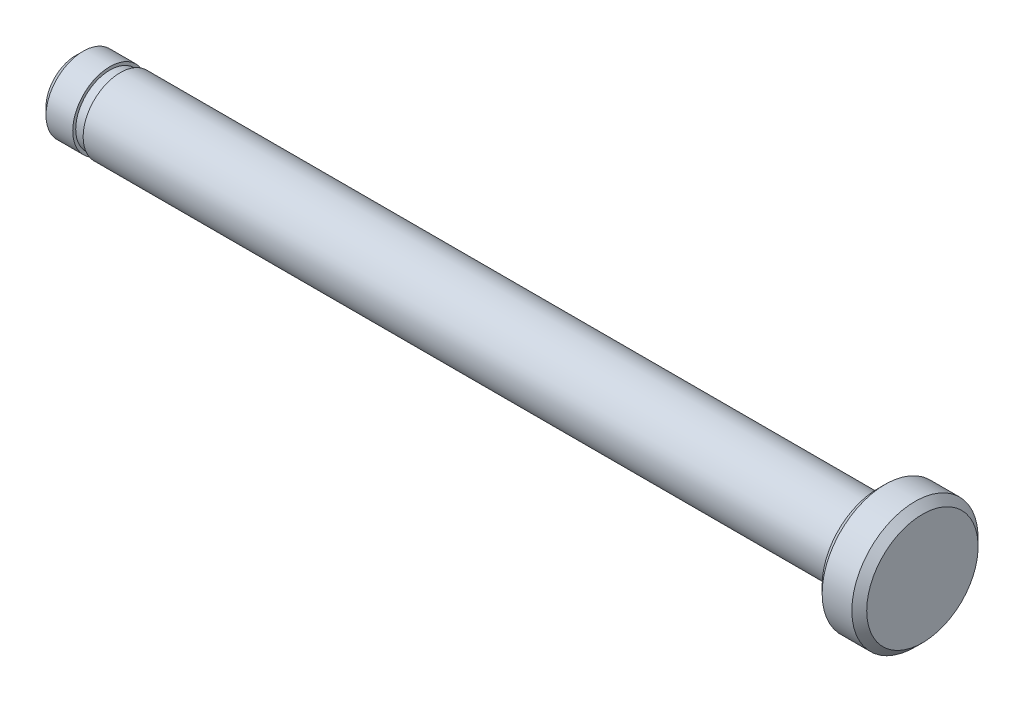
ISO-10303-21;
HEADER;
FILE_DESCRIPTION(('STEP AP214'),'2;1');
FILE_NAME('part.step','',(''),(''),'','','');
FILE_SCHEMA(('AUTOMOTIVE_DESIGN { 1 0 10303 214 1 1 1 1 }'));
ENDSEC;
DATA;
#1=APPLICATION_CONTEXT('core data for automotive mechanical design processes');
#2=APPLICATION_PROTOCOL_DEFINITION('international standard','automotive_design',2000,#1);
#3=PRODUCT_CONTEXT('',#1,'mechanical');
#4=PRODUCT('Part','Part','',(#3));
#5=PRODUCT_RELATED_PRODUCT_CATEGORY('part','',(#4));
#6=PRODUCT_DEFINITION_FORMATION('','',#4);
#7=PRODUCT_DEFINITION_CONTEXT('part definition',#1,'design');
#8=PRODUCT_DEFINITION('design','',#6,#7);
#9=PRODUCT_DEFINITION_SHAPE('','',#8);
#10=(LENGTH_UNIT() NAMED_UNIT(*) SI_UNIT(.MILLI.,.METRE.));
#11=(NAMED_UNIT(*) PLANE_ANGLE_UNIT() SI_UNIT($,.RADIAN.));
#12=(NAMED_UNIT(*) SI_UNIT($,.STERADIAN.) SOLID_ANGLE_UNIT());
#13=UNCERTAINTY_MEASURE_WITH_UNIT(LENGTH_MEASURE(1.E-05),#10,'distance_accuracy_value','');
#14=(GEOMETRIC_REPRESENTATION_CONTEXT(3) GLOBAL_UNCERTAINTY_ASSIGNED_CONTEXT((#13)) GLOBAL_UNIT_ASSIGNED_CONTEXT((#10,
#11,#12)) REPRESENTATION_CONTEXT('',''));
#15=CARTESIAN_POINT('',(0.,0.,0.));
#16=DIRECTION('',(0.,0.,1.));
#17=DIRECTION('',(1.,0.,0.));
#18=AXIS2_PLACEMENT_3D('',#15,#16,#17);
#19=CARTESIAN_POINT('',(-28.,0.,0.));
#20=DIRECTION('',(1.,0.,0.));
#21=DIRECTION('',(0.,0.,-1.));
#22=AXIS2_PLACEMENT_3D('',#19,#20,#21);
#23=CONICAL_SURFACE('',#22,2.49999999999999,0.785398163397448);
#24=CARTESIAN_POINT('',(-28.5,0.,0.));
#25=DIRECTION('',(-1.,0.,0.));
#26=DIRECTION('',(0.,0.,1.));
#27=AXIS2_PLACEMENT_3D('',#24,#25,#26);
#28=CIRCLE('',#27,1.99999999999999);
#29=CARTESIAN_POINT('',(-28.5,0.,1.99999999999999));
#30=VERTEX_POINT('',#29);
#31=EDGE_CURVE('E70',#30,#30,#28,.T.);
#32=ORIENTED_EDGE('',*,*,#31,.F.);
#33=EDGE_LOOP('',(#32));
#34=FACE_BOUND('',#33,.T.);
#35=CARTESIAN_POINT('',(-28.,0.,0.));
#36=DIRECTION('',(-1.,0.,0.));
#37=DIRECTION('',(0.,0.,1.));
#38=AXIS2_PLACEMENT_3D('',#35,#36,#37);
#39=CIRCLE('',#38,2.49999999999999);
#40=CARTESIAN_POINT('',(-28.,0.,2.49999999999999));
#41=VERTEX_POINT('',#40);
#42=EDGE_CURVE('E10',#41,#41,#39,.T.);
#43=ORIENTED_EDGE('',*,*,#42,.T.);
#44=EDGE_LOOP('',(#43));
#45=FACE_BOUND('',#44,.T.);
#46=ADVANCED_FACE('F33',(#34,#45),#23,.T.);
#47=CARTESIAN_POINT('',(-28.5,0.,0.));
#48=DIRECTION('',(-1.,0.,0.));
#49=DIRECTION('',(0.,0.,1.));
#50=AXIS2_PLACEMENT_3D('',#47,#48,#49);
#51=CYLINDRICAL_SURFACE('',#50,2.49999999999999);
#52=ORIENTED_EDGE('',*,*,#42,.F.);
#53=EDGE_LOOP('',(#52));
#54=FACE_BOUND('',#53,.T.);
#55=CARTESIAN_POINT('',(-26.2,0.,0.));
#56=DIRECTION('',(-1.,0.,0.));
#57=DIRECTION('',(0.,0.,1.));
#58=AXIS2_PLACEMENT_3D('',#55,#56,#57);
#59=CIRCLE('',#58,2.49999999999999);
#60=CARTESIAN_POINT('',(-26.2,0.,2.49999999999999));
#61=VERTEX_POINT('',#60);
#62=EDGE_CURVE('E39',#61,#61,#59,.T.);
#63=ORIENTED_EDGE('',*,*,#62,.T.);
#64=EDGE_LOOP('',(#63));
#65=FACE_BOUND('',#64,.T.);
#66=ADVANCED_FACE('F77',(#54,#65),#51,.T.);
#67=CARTESIAN_POINT('',(-26.2,0.,-2.3));
#68=DIRECTION('',(-1.,0.,0.));
#69=DIRECTION('',(0.,0.,1.));
#70=AXIS2_PLACEMENT_3D('',#67,#68,#69);
#71=PLANE('',#70);
#72=ORIENTED_EDGE('',*,*,#62,.F.);
#73=EDGE_LOOP('',(#72));
#74=FACE_BOUND('',#73,.T.);
#75=CARTESIAN_POINT('',(-26.2,0.,0.));
#76=DIRECTION('',(-1.,0.,0.));
#77=DIRECTION('',(0.,0.,1.));
#78=AXIS2_PLACEMENT_3D('',#75,#76,#77);
#79=CIRCLE('',#78,2.3);
#80=CARTESIAN_POINT('',(-26.2,0.,2.3));
#81=VERTEX_POINT('',#80);
#82=EDGE_CURVE('E43',#81,#81,#79,.T.);
#83=ORIENTED_EDGE('',*,*,#82,.T.);
#84=EDGE_LOOP('',(#83));
#85=FACE_BOUND('',#84,.T.);
#86=ADVANCED_FACE('F81',(#74,#85),#71,.F.);
#87=CARTESIAN_POINT('',(-28.5,0.,0.));
#88=DIRECTION('',(-1.,0.,0.));
#89=DIRECTION('',(0.,0.,1.));
#90=AXIS2_PLACEMENT_3D('',#87,#88,#89);
#91=CYLINDRICAL_SURFACE('',#90,2.3);
#92=ORIENTED_EDGE('',*,*,#82,.F.);
#93=EDGE_LOOP('',(#92));
#94=FACE_BOUND('',#93,.T.);
#95=CARTESIAN_POINT('',(-25.5,0.,0.));
#96=DIRECTION('',(-1.,0.,0.));
#97=DIRECTION('',(0.,0.,1.));
#98=AXIS2_PLACEMENT_3D('',#95,#96,#97);
#99=CIRCLE('',#98,2.3);
#100=CARTESIAN_POINT('',(-25.5,0.,2.3));
#101=VERTEX_POINT('',#100);
#102=EDGE_CURVE('E47',#101,#101,#99,.T.);
#103=ORIENTED_EDGE('',*,*,#102,.T.);
#104=EDGE_LOOP('',(#103));
#105=FACE_BOUND('',#104,.T.);
#106=ADVANCED_FACE('F86',(#94,#105),#91,.T.);
#107=CARTESIAN_POINT('',(-25.5,0.,-2.49999999999999));
#108=DIRECTION('',(1.,0.,0.));
#109=DIRECTION('',(0.,0.,-1.));
#110=AXIS2_PLACEMENT_3D('',#107,#108,#109);
#111=PLANE('',#110);
#112=ORIENTED_EDGE('',*,*,#102,.F.);
#113=EDGE_LOOP('',(#112));
#114=FACE_BOUND('',#113,.T.);
#115=CARTESIAN_POINT('',(-25.5,0.,0.));
#116=DIRECTION('',(-1.,0.,0.));
#117=DIRECTION('',(0.,0.,1.));
#118=AXIS2_PLACEMENT_3D('',#115,#116,#117);
#119=CIRCLE('',#118,2.49999999999999);
#120=CARTESIAN_POINT('',(-25.5,0.,2.49999999999999));
#121=VERTEX_POINT('',#120);
#122=EDGE_CURVE('E52',#121,#121,#119,.T.);
#123=ORIENTED_EDGE('',*,*,#122,.T.);
#124=EDGE_LOOP('',(#123));
#125=FACE_BOUND('',#124,.T.);
#126=ADVANCED_FACE('F92',(#114,#125),#111,.F.);
#127=CARTESIAN_POINT('',(-28.5,0.,0.));
#128=DIRECTION('',(-1.,0.,0.));
#129=DIRECTION('',(0.,0.,1.));
#130=AXIS2_PLACEMENT_3D('',#127,#128,#129);
#131=CYLINDRICAL_SURFACE('',#130,2.5);
#132=ORIENTED_EDGE('',*,*,#122,.F.);
#133=EDGE_LOOP('',(#132));
#134=FACE_BOUND('',#133,.T.);
#135=CARTESIAN_POINT('',(25.5,0.,0.));
#136=DIRECTION('',(-1.,0.,0.));
#137=DIRECTION('',(0.,0.,1.));
#138=AXIS2_PLACEMENT_3D('',#135,#136,#137);
#139=CIRCLE('',#138,2.5);
#140=CARTESIAN_POINT('',(25.5,0.,2.5));
#141=VERTEX_POINT('',#140);
#142=EDGE_CURVE('E55',#141,#141,#139,.T.);
#143=ORIENTED_EDGE('',*,*,#142,.T.);
#144=EDGE_LOOP('',(#143));
#145=FACE_BOUND('',#144,.T.);
#146=ADVANCED_FACE('F96',(#134,#145),#131,.T.);
#147=CARTESIAN_POINT('',(25.5,0.,-3.75));
#148=DIRECTION('',(1.,0.,0.));
#149=DIRECTION('',(0.,0.,-1.));
#150=AXIS2_PLACEMENT_3D('',#147,#148,#149);
#151=PLANE('',#150);
#152=ORIENTED_EDGE('',*,*,#142,.F.);
#153=EDGE_LOOP('',(#152));
#154=FACE_BOUND('',#153,.T.);
#155=CARTESIAN_POINT('',(25.5,0.,0.));
#156=DIRECTION('',(-1.,0.,0.));
#157=DIRECTION('',(0.,0.,1.));
#158=AXIS2_PLACEMENT_3D('',#155,#156,#157);
#159=CIRCLE('',#158,3.75);
#160=CARTESIAN_POINT('',(25.5,0.,3.75));
#161=VERTEX_POINT('',#160);
#162=EDGE_CURVE('E58',#161,#161,#159,.T.);
#163=ORIENTED_EDGE('',*,*,#162,.T.);
#164=EDGE_LOOP('',(#163));
#165=FACE_BOUND('',#164,.T.);
#166=ADVANCED_FACE('F100',(#154,#165),#151,.F.);
#167=CARTESIAN_POINT('',(26.,0.,0.));
#168=DIRECTION('',(1.,0.,0.));
#169=DIRECTION('',(0.,0.,-1.));
#170=AXIS2_PLACEMENT_3D('',#167,#168,#169);
#171=CONICAL_SURFACE('',#170,4.25,0.785398163397448);
#172=ORIENTED_EDGE('',*,*,#162,.F.);
#173=EDGE_LOOP('',(#172));
#174=FACE_BOUND('',#173,.T.);
#175=CARTESIAN_POINT('',(26.,0.,0.));
#176=DIRECTION('',(-1.,0.,0.));
#177=DIRECTION('',(0.,0.,1.));
#178=AXIS2_PLACEMENT_3D('',#175,#176,#177);
#179=CIRCLE('',#178,4.25);
#180=CARTESIAN_POINT('',(26.,0.,4.25));
#181=VERTEX_POINT('',#180);
#182=EDGE_CURVE('E61',#181,#181,#179,.T.);
#183=ORIENTED_EDGE('',*,*,#182,.T.);
#184=EDGE_LOOP('',(#183));
#185=FACE_BOUND('',#184,.T.);
#186=ADVANCED_FACE('F104',(#174,#185),#171,.T.);
#187=CARTESIAN_POINT('',(-28.5,0.,0.));
#188=DIRECTION('',(-1.,0.,0.));
#189=DIRECTION('',(0.,0.,1.));
#190=AXIS2_PLACEMENT_3D('',#187,#188,#189);
#191=CYLINDRICAL_SURFACE('',#190,4.25);
#192=ORIENTED_EDGE('',*,*,#182,.F.);
#193=EDGE_LOOP('',(#192));
#194=FACE_BOUND('',#193,.T.);
#195=CARTESIAN_POINT('',(28.,0.,0.));
#196=DIRECTION('',(-1.,0.,0.));
#197=DIRECTION('',(0.,0.,1.));
#198=AXIS2_PLACEMENT_3D('',#195,#196,#197);
#199=CIRCLE('',#198,4.25);
#200=CARTESIAN_POINT('',(28.,0.,4.25));
#201=VERTEX_POINT('',#200);
#202=EDGE_CURVE('E64',#201,#201,#199,.T.);
#203=ORIENTED_EDGE('',*,*,#202,.T.);
#204=EDGE_LOOP('',(#203));
#205=FACE_BOUND('',#204,.T.);
#206=ADVANCED_FACE('F108',(#194,#205),#191,.T.);
#207=CARTESIAN_POINT('',(28.5,0.,0.));
#208=DIRECTION('',(-1.,0.,0.));
#209=DIRECTION('',(0.,0.,1.));
#210=AXIS2_PLACEMENT_3D('',#207,#208,#209);
#211=CONICAL_SURFACE('',#210,3.75,0.785398163397448);
#212=ORIENTED_EDGE('',*,*,#202,.F.);
#213=EDGE_LOOP('',(#212));
#214=FACE_BOUND('',#213,.T.);
#215=CARTESIAN_POINT('',(28.5,0.,0.));
#216=DIRECTION('',(-1.,0.,0.));
#217=DIRECTION('',(0.,0.,1.));
#218=AXIS2_PLACEMENT_3D('',#215,#216,#217);
#219=CIRCLE('',#218,3.75);
#220=CARTESIAN_POINT('',(28.5,0.,3.75));
#221=VERTEX_POINT('',#220);
#222=EDGE_CURVE('E67',#221,#221,#219,.T.);
#223=ORIENTED_EDGE('',*,*,#222,.T.);
#224=EDGE_LOOP('',(#223));
#225=FACE_BOUND('',#224,.T.);
#226=ADVANCED_FACE('F112',(#214,#225),#211,.T.);
#227=CARTESIAN_POINT('',(28.5,0.,0.));
#228=DIRECTION('',(-1.,0.,0.));
#229=DIRECTION('',(0.,0.,1.));
#230=AXIS2_PLACEMENT_3D('',#227,#228,#229);
#231=PLANE('',#230);
#232=ORIENTED_EDGE('',*,*,#222,.F.);
#233=EDGE_LOOP('',(#232));
#234=FACE_BOUND('',#233,.T.);
#235=ADVANCED_FACE('F116',(#234),#231,.F.);
#236=CARTESIAN_POINT('',(-28.5,0.,-1.99999999999999));
#237=DIRECTION('',(1.,0.,0.));
#238=DIRECTION('',(0.,0.,-1.));
#239=AXIS2_PLACEMENT_3D('',#236,#237,#238);
#240=PLANE('',#239);
#241=ORIENTED_EDGE('',*,*,#31,.T.);
#242=EDGE_LOOP('',(#241));
#243=FACE_BOUND('',#242,.T.);
#244=ADVANCED_FACE('F74',(#243),#240,.F.);
#245=CLOSED_SHELL('',(#46,#66,#86,#106,#126,#146,#166,#186,#206,#226,#235,#244));
#246=MANIFOLD_SOLID_BREP('B2',#245);
#247=ADVANCED_BREP_SHAPE_REPRESENTATION('',(#18,#246),#14);
#248=SHAPE_DEFINITION_REPRESENTATION(#9,#247);
ENDSEC;
END-ISO-10303-21;
